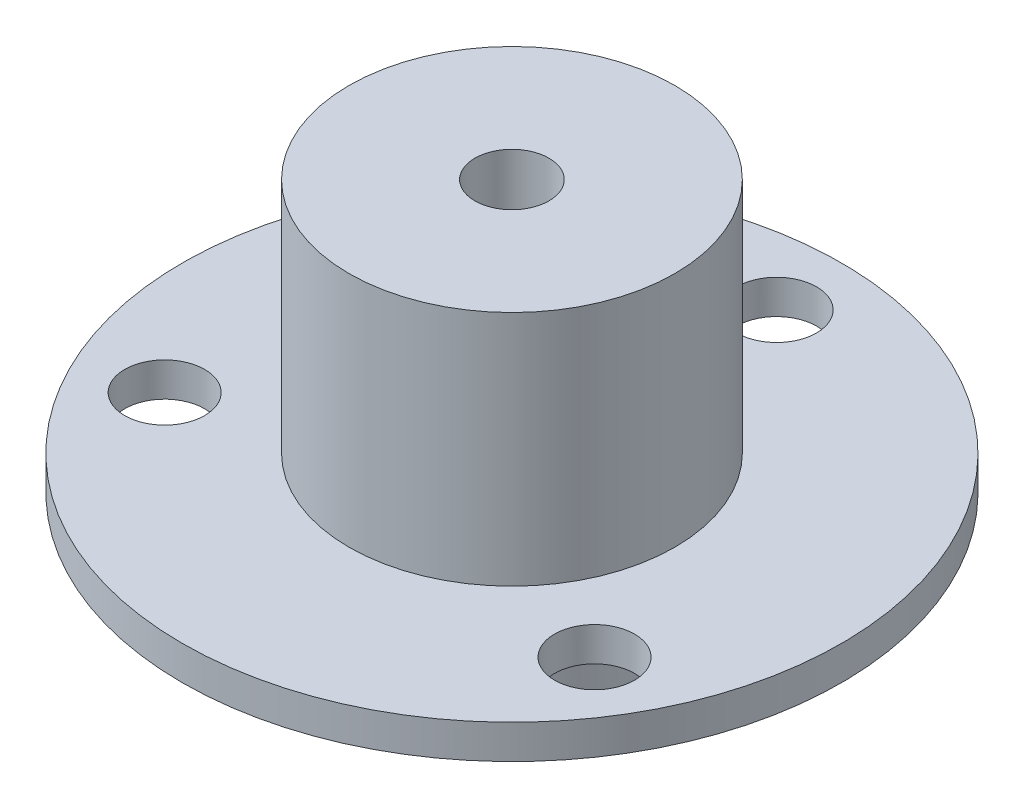
ISO-10303-21;
HEADER;
FILE_DESCRIPTION(('STEP AP214'),'2;1');
FILE_NAME('part.step','',(''),(''),'','','');
FILE_SCHEMA(('AUTOMOTIVE_DESIGN { 1 0 10303 214 1 1 1 1 }'));
ENDSEC;
DATA;
#1=APPLICATION_CONTEXT('core data for automotive mechanical design processes');
#2=APPLICATION_PROTOCOL_DEFINITION('international standard','automotive_design',2000,#1);
#3=PRODUCT_CONTEXT('',#1,'mechanical');
#4=PRODUCT('Part','Part','',(#3));
#5=PRODUCT_RELATED_PRODUCT_CATEGORY('part','',(#4));
#6=PRODUCT_DEFINITION_FORMATION('','',#4);
#7=PRODUCT_DEFINITION_CONTEXT('part definition',#1,'design');
#8=PRODUCT_DEFINITION('design','',#6,#7);
#9=PRODUCT_DEFINITION_SHAPE('','',#8);
#10=(LENGTH_UNIT() NAMED_UNIT(*) SI_UNIT(.MILLI.,.METRE.));
#11=(NAMED_UNIT(*) PLANE_ANGLE_UNIT() SI_UNIT($,.RADIAN.));
#12=(NAMED_UNIT(*) SI_UNIT($,.STERADIAN.) SOLID_ANGLE_UNIT());
#13=UNCERTAINTY_MEASURE_WITH_UNIT(LENGTH_MEASURE(1.E-05),#10,'distance_accuracy_value','');
#14=(GEOMETRIC_REPRESENTATION_CONTEXT(3) GLOBAL_UNCERTAINTY_ASSIGNED_CONTEXT((#13)) GLOBAL_UNIT_ASSIGNED_CONTEXT((#10,
#11,#12)) REPRESENTATION_CONTEXT('',''));
#15=CARTESIAN_POINT('',(0.,0.,0.));
#16=DIRECTION('',(0.,0.,1.));
#17=DIRECTION('',(1.,0.,0.));
#18=AXIS2_PLACEMENT_3D('',#15,#16,#17);
#19=CARTESIAN_POINT('',(0.,5.,0.));
#20=DIRECTION('',(0.,-1.,0.));
#21=DIRECTION('',(0.,0.,-1.));
#22=AXIS2_PLACEMENT_3D('',#19,#20,#21);
#23=CYLINDRICAL_SURFACE('',#22,11.);
#24=CARTESIAN_POINT('',(0.,5.,0.));
#25=DIRECTION('',(0.,1.,0.));
#26=DIRECTION('',(0.,0.,1.));
#27=AXIS2_PLACEMENT_3D('',#24,#25,#26);
#28=CIRCLE('',#27,11.);
#29=CARTESIAN_POINT('',(0.,5.,11.));
#30=VERTEX_POINT('',#29);
#31=EDGE_CURVE('E45',#30,#30,#28,.T.);
#32=ORIENTED_EDGE('',*,*,#31,.F.);
#33=EDGE_LOOP('',(#32));
#34=FACE_BOUND('',#33,.T.);
#35=CARTESIAN_POINT('',(0.,0.,0.));
#36=DIRECTION('',(0.,1.,0.));
#37=DIRECTION('',(0.,0.,1.));
#38=AXIS2_PLACEMENT_3D('',#35,#36,#37);
#39=CIRCLE('',#38,11.);
#40=CARTESIAN_POINT('',(0.,0.,11.));
#41=VERTEX_POINT('',#40);
#42=EDGE_CURVE('E51',#41,#41,#39,.T.);
#43=ORIENTED_EDGE('',*,*,#42,.T.);
#44=EDGE_LOOP('',(#43));
#45=FACE_BOUND('',#44,.T.);
#46=ADVANCED_FACE('F37',(#34,#45),#23,.T.);
#47=CARTESIAN_POINT('',(0.,0.,0.));
#48=DIRECTION('',(0.,1.,0.));
#49=DIRECTION('',(0.,0.,1.));
#50=AXIS2_PLACEMENT_3D('',#47,#48,#49);
#51=PLANE('',#50);
#52=CARTESIAN_POINT('',(0.,0.,0.));
#53=DIRECTION('',(0.,-1.,0.));
#54=DIRECTION('',(0.,0.,-1.));
#55=AXIS2_PLACEMENT_3D('',#52,#53,#54);
#56=CIRCLE('',#55,2.5);
#57=CARTESIAN_POINT('',(0.,0.,-2.5));
#58=VERTEX_POINT('',#57);
#59=EDGE_CURVE('E142',#58,#58,#56,.T.);
#60=ORIENTED_EDGE('',*,*,#59,.F.);
#61=EDGE_LOOP('',(#60));
#62=FACE_BOUND('',#61,.T.);
#63=ORIENTED_EDGE('',*,*,#42,.F.);
#64=EDGE_LOOP('',(#63));
#65=FACE_BOUND('',#64,.T.);
#66=ADVANCED_FACE('F69',(#62,#65),#51,.F.);
#67=CARTESIAN_POINT('',(0.,7.3,0.));
#68=DIRECTION('',(0.,-1.,0.));
#69=DIRECTION('',(0.,0.,-1.));
#70=AXIS2_PLACEMENT_3D('',#67,#68,#69);
#71=CYLINDRICAL_SURFACE('',#70,22.25);
#72=CARTESIAN_POINT('',(0.,7.3,0.));
#73=DIRECTION('',(0.,1.,0.));
#74=DIRECTION('',(0.,0.,1.));
#75=AXIS2_PLACEMENT_3D('',#72,#73,#74);
#76=CIRCLE('',#75,22.25);
#77=CARTESIAN_POINT('',(0.,7.3,22.25));
#78=VERTEX_POINT('',#77);
#79=EDGE_CURVE('E57',#78,#78,#76,.T.);
#80=ORIENTED_EDGE('',*,*,#79,.F.);
#81=EDGE_LOOP('',(#80));
#82=FACE_BOUND('',#81,.T.);
#83=CARTESIAN_POINT('',(0.,5.,0.));
#84=DIRECTION('',(0.,1.,0.));
#85=DIRECTION('',(0.,0.,1.));
#86=AXIS2_PLACEMENT_3D('',#83,#84,#85);
#87=CIRCLE('',#86,22.25);
#88=CARTESIAN_POINT('',(0.,5.,22.25));
#89=VERTEX_POINT('',#88);
#90=EDGE_CURVE('E61',#89,#89,#87,.T.);
#91=ORIENTED_EDGE('',*,*,#90,.T.);
#92=EDGE_LOOP('',(#91));
#93=FACE_BOUND('',#92,.T.);
#94=ADVANCED_FACE('F71',(#82,#93),#71,.T.);
#95=CARTESIAN_POINT('',(0.,7.3,0.));
#96=DIRECTION('',(0.,1.,0.));
#97=DIRECTION('',(0.,0.,1.));
#98=AXIS2_PLACEMENT_3D('',#95,#96,#97);
#99=PLANE('',#98);
#100=CARTESIAN_POINT('',(-15.2702119190535,7.3,8.17438853659376));
#101=DIRECTION('',(0.,1.,0.));
#102=DIRECTION('',(0.,0.,1.));
#103=AXIS2_PLACEMENT_3D('',#100,#101,#102);
#104=CIRCLE('',#103,2.7);
#105=CARTESIAN_POINT('',(-15.2702119190535,7.3,10.8743885365938));
#106=VERTEX_POINT('',#105);
#107=EDGE_CURVE('E118',#106,#106,#104,.T.);
#108=ORIENTED_EDGE('',*,*,#107,.F.);
#109=EDGE_LOOP('',(#108));
#110=FACE_BOUND('',#109,.T.);
#111=CARTESIAN_POINT('',(0.55587782643227,7.3,-17.3115857113692));
#112=DIRECTION('',(0.,1.,0.));
#113=DIRECTION('',(0.,0.,1.));
#114=AXIS2_PLACEMENT_3D('',#111,#112,#113);
#115=CIRCLE('',#114,2.7);
#116=CARTESIAN_POINT('',(0.55587782643227,7.3,-14.6115857113692));
#117=VERTEX_POINT('',#116);
#118=EDGE_CURVE('E129',#117,#117,#115,.T.);
#119=ORIENTED_EDGE('',*,*,#118,.F.);
#120=EDGE_LOOP('',(#119));
#121=FACE_BOUND('',#120,.T.);
#122=CARTESIAN_POINT('',(14.7143340926213,7.3,9.13719717477541));
#123=DIRECTION('',(0.,1.,0.));
#124=DIRECTION('',(0.,0.,1.));
#125=AXIS2_PLACEMENT_3D('',#122,#123,#124);
#126=CIRCLE('',#125,2.7);
#127=CARTESIAN_POINT('',(14.7143340926213,7.3,11.8371971747754));
#128=VERTEX_POINT('',#127);
#129=EDGE_CURVE('E123',#128,#128,#126,.T.);
#130=ORIENTED_EDGE('',*,*,#129,.F.);
#131=EDGE_LOOP('',(#130));
#132=FACE_BOUND('',#131,.T.);
#133=CARTESIAN_POINT('',(0.,7.3,0.));
#134=DIRECTION('',(0.,1.,0.));
#135=DIRECTION('',(0.,0.,1.));
#136=AXIS2_PLACEMENT_3D('',#133,#134,#135);
#137=CIRCLE('',#136,11.);
#138=CARTESIAN_POINT('',(0.,7.3,11.));
#139=VERTEX_POINT('',#138);
#140=EDGE_CURVE('E10',#139,#139,#137,.T.);
#141=ORIENTED_EDGE('',*,*,#140,.F.);
#142=EDGE_LOOP('',(#141));
#143=FACE_BOUND('',#142,.T.);
#144=ORIENTED_EDGE('',*,*,#79,.T.);
#145=EDGE_LOOP('',(#144));
#146=FACE_BOUND('',#145,.T.);
#147=ADVANCED_FACE('F77',(#110,#121,#132,#143,#146),#99,.T.);
#148=CARTESIAN_POINT('',(0.,5.,0.));
#149=DIRECTION('',(0.,1.,0.));
#150=DIRECTION('',(0.,0.,1.));
#151=AXIS2_PLACEMENT_3D('',#148,#149,#150);
#152=PLANE('',#151);
#153=CARTESIAN_POINT('',(-15.2702119190535,5.,8.17438853659376));
#154=DIRECTION('',(0.,-1.,0.));
#155=DIRECTION('',(0.,0.,-1.));
#156=AXIS2_PLACEMENT_3D('',#153,#154,#155);
#157=CIRCLE('',#156,2.7);
#158=CARTESIAN_POINT('',(-15.2702119190535,5.,5.47438853659376));
#159=VERTEX_POINT('',#158);
#160=EDGE_CURVE('E121',#159,#159,#157,.T.);
#161=ORIENTED_EDGE('',*,*,#160,.F.);
#162=EDGE_LOOP('',(#161));
#163=FACE_BOUND('',#162,.T.);
#164=CARTESIAN_POINT('',(0.55587782643227,5.,-17.3115857113692));
#165=DIRECTION('',(0.,-1.,0.));
#166=DIRECTION('',(0.,0.,-1.));
#167=AXIS2_PLACEMENT_3D('',#164,#165,#166);
#168=CIRCLE('',#167,2.7);
#169=CARTESIAN_POINT('',(0.55587782643227,5.,-20.0115857113692));
#170=VERTEX_POINT('',#169);
#171=EDGE_CURVE('E124',#170,#170,#168,.T.);
#172=ORIENTED_EDGE('',*,*,#171,.F.);
#173=EDGE_LOOP('',(#172));
#174=FACE_BOUND('',#173,.T.);
#175=CARTESIAN_POINT('',(14.7143340926213,5.,9.13719717477541));
#176=DIRECTION('',(0.,-1.,0.));
#177=DIRECTION('',(0.,0.,-1.));
#178=AXIS2_PLACEMENT_3D('',#175,#176,#177);
#179=CIRCLE('',#178,2.7);
#180=CARTESIAN_POINT('',(14.7143340926213,5.,6.43719717477541));
#181=VERTEX_POINT('',#180);
#182=EDGE_CURVE('E132',#181,#181,#179,.T.);
#183=ORIENTED_EDGE('',*,*,#182,.F.);
#184=EDGE_LOOP('',(#183));
#185=FACE_BOUND('',#184,.T.);
#186=ORIENTED_EDGE('',*,*,#31,.T.);
#187=EDGE_LOOP('',(#186));
#188=FACE_BOUND('',#187,.T.);
#189=ORIENTED_EDGE('',*,*,#90,.F.);
#190=EDGE_LOOP('',(#189));
#191=FACE_BOUND('',#190,.T.);
#192=ADVANCED_FACE('F83',(#163,#174,#185,#188,#191),#152,.F.);
#193=CARTESIAN_POINT('',(0.,23.3,0.));
#194=DIRECTION('',(0.,-1.,0.));
#195=DIRECTION('',(0.,0.,-1.));
#196=AXIS2_PLACEMENT_3D('',#193,#194,#195);
#197=CYLINDRICAL_SURFACE('',#196,11.);
#198=CARTESIAN_POINT('',(0.,23.3,0.));
#199=DIRECTION('',(0.,1.,0.));
#200=DIRECTION('',(0.,0.,1.));
#201=AXIS2_PLACEMENT_3D('',#198,#199,#200);
#202=CIRCLE('',#201,11.);
#203=CARTESIAN_POINT('',(0.,23.3,11.));
#204=VERTEX_POINT('',#203);
#205=EDGE_CURVE('E55',#204,#204,#202,.T.);
#206=ORIENTED_EDGE('',*,*,#205,.F.);
#207=EDGE_LOOP('',(#206));
#208=FACE_BOUND('',#207,.T.);
#209=ORIENTED_EDGE('',*,*,#140,.T.);
#210=EDGE_LOOP('',(#209));
#211=FACE_BOUND('',#210,.T.);
#212=ADVANCED_FACE('F86',(#208,#211),#197,.T.);
#213=CARTESIAN_POINT('',(0.,23.3,0.));
#214=DIRECTION('',(0.,1.,0.));
#215=DIRECTION('',(0.,0.,1.));
#216=AXIS2_PLACEMENT_3D('',#213,#214,#215);
#217=PLANE('',#216);
#218=CARTESIAN_POINT('',(0.,23.3,0.));
#219=DIRECTION('',(0.,1.,0.));
#220=DIRECTION('',(0.,0.,1.));
#221=AXIS2_PLACEMENT_3D('',#218,#219,#220);
#222=CIRCLE('',#221,2.5);
#223=CARTESIAN_POINT('',(0.,23.3,2.5));
#224=VERTEX_POINT('',#223);
#225=EDGE_CURVE('E40',#224,#224,#222,.T.);
#226=ORIENTED_EDGE('',*,*,#225,.F.);
#227=EDGE_LOOP('',(#226));
#228=FACE_BOUND('',#227,.T.);
#229=ORIENTED_EDGE('',*,*,#205,.T.);
#230=EDGE_LOOP('',(#229));
#231=FACE_BOUND('',#230,.T.);
#232=ADVANCED_FACE('F93',(#228,#231),#217,.T.);
#233=CARTESIAN_POINT('',(0.,30.,0.));
#234=DIRECTION('',(0.,-1.,0.));
#235=DIRECTION('',(0.,0.,-1.));
#236=AXIS2_PLACEMENT_3D('',#233,#234,#235);
#237=CYLINDRICAL_SURFACE('',#236,2.5);
#238=ORIENTED_EDGE('',*,*,#225,.T.);
#239=EDGE_LOOP('',(#238));
#240=FACE_BOUND('',#239,.T.);
#241=ORIENTED_EDGE('',*,*,#59,.T.);
#242=EDGE_LOOP('',(#241));
#243=FACE_BOUND('',#242,.T.);
#244=ADVANCED_FACE('F97',(#240,#243),#237,.F.);
#245=CARTESIAN_POINT('',(14.7143340926213,21.,9.13719717477541));
#246=DIRECTION('',(0.,-1.,0.));
#247=DIRECTION('',(0.,0.,-1.));
#248=AXIS2_PLACEMENT_3D('',#245,#246,#247);
#249=CYLINDRICAL_SURFACE('',#248,2.7);
#250=ORIENTED_EDGE('',*,*,#129,.T.);
#251=EDGE_LOOP('',(#250));
#252=FACE_BOUND('',#251,.T.);
#253=ORIENTED_EDGE('',*,*,#182,.T.);
#254=EDGE_LOOP('',(#253));
#255=FACE_BOUND('',#254,.T.);
#256=ADVANCED_FACE('F101',(#252,#255),#249,.F.);
#257=CARTESIAN_POINT('',(0.55587782643227,21.,-17.3115857113692));
#258=DIRECTION('',(0.,-1.,0.));
#259=DIRECTION('',(0.,0.,-1.));
#260=AXIS2_PLACEMENT_3D('',#257,#258,#259);
#261=CYLINDRICAL_SURFACE('',#260,2.7);
#262=ORIENTED_EDGE('',*,*,#118,.T.);
#263=EDGE_LOOP('',(#262));
#264=FACE_BOUND('',#263,.T.);
#265=ORIENTED_EDGE('',*,*,#171,.T.);
#266=EDGE_LOOP('',(#265));
#267=FACE_BOUND('',#266,.T.);
#268=ADVANCED_FACE('F105',(#264,#267),#261,.F.);
#269=CARTESIAN_POINT('',(-15.2702119190535,21.,8.17438853659376));
#270=DIRECTION('',(0.,-1.,0.));
#271=DIRECTION('',(0.,0.,-1.));
#272=AXIS2_PLACEMENT_3D('',#269,#270,#271);
#273=CYLINDRICAL_SURFACE('',#272,2.7);
#274=ORIENTED_EDGE('',*,*,#107,.T.);
#275=EDGE_LOOP('',(#274));
#276=FACE_BOUND('',#275,.T.);
#277=ORIENTED_EDGE('',*,*,#160,.T.);
#278=EDGE_LOOP('',(#277));
#279=FACE_BOUND('',#278,.T.);
#280=ADVANCED_FACE('F109',(#276,#279),#273,.F.);
#281=CLOSED_SHELL('',(#46,#66,#94,#147,#192,#212,#232,#244,#256,#268,#280));
#282=MANIFOLD_SOLID_BREP('B2',#281);
#283=ADVANCED_BREP_SHAPE_REPRESENTATION('',(#18,#282),#14);
#284=SHAPE_DEFINITION_REPRESENTATION(#9,#283);
ENDSEC;
END-ISO-10303-21;
